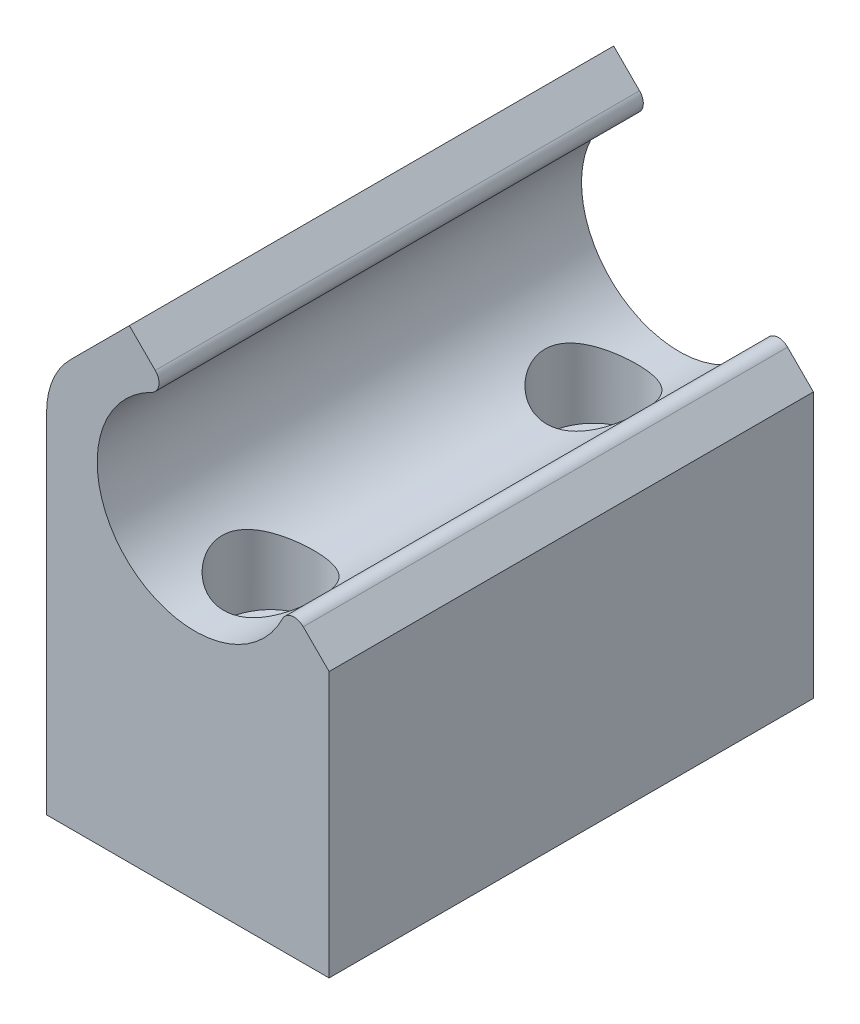
ISO-10303-21;
HEADER;
FILE_DESCRIPTION(('STEP AP214'),'2;1');
FILE_NAME('part.step','',(''),(''),'','','');
FILE_SCHEMA(('AUTOMOTIVE_DESIGN { 1 0 10303 214 1 1 1 1 }'));
ENDSEC;
DATA;
#1=APPLICATION_CONTEXT('core data for automotive mechanical design processes');
#2=APPLICATION_PROTOCOL_DEFINITION('international standard','automotive_design',2000,#1);
#3=PRODUCT_CONTEXT('',#1,'mechanical');
#4=PRODUCT('Part','Part','',(#3));
#5=PRODUCT_RELATED_PRODUCT_CATEGORY('part','',(#4));
#6=PRODUCT_DEFINITION_FORMATION('','',#4);
#7=PRODUCT_DEFINITION_CONTEXT('part definition',#1,'design');
#8=PRODUCT_DEFINITION('design','',#6,#7);
#9=PRODUCT_DEFINITION_SHAPE('','',#8);
#10=(LENGTH_UNIT() NAMED_UNIT(*) SI_UNIT(.MILLI.,.METRE.));
#11=(NAMED_UNIT(*) PLANE_ANGLE_UNIT() SI_UNIT($,.RADIAN.));
#12=(NAMED_UNIT(*) SI_UNIT($,.STERADIAN.) SOLID_ANGLE_UNIT());
#13=UNCERTAINTY_MEASURE_WITH_UNIT(LENGTH_MEASURE(1.E-05),#10,'distance_accuracy_value','');
#14=(GEOMETRIC_REPRESENTATION_CONTEXT(3) GLOBAL_UNCERTAINTY_ASSIGNED_CONTEXT((#13)) GLOBAL_UNIT_ASSIGNED_CONTEXT((#10,
#11,#12)) REPRESENTATION_CONTEXT('',''));
#15=CARTESIAN_POINT('',(0.,0.,0.));
#16=DIRECTION('',(0.,0.,1.));
#17=DIRECTION('',(1.,0.,0.));
#18=AXIS2_PLACEMENT_3D('',#15,#16,#17);
#19=CARTESIAN_POINT('',(9.1857781045255,20.4974390727315,30.));
#20=DIRECTION('',(0.,0.,-1.));
#21=DIRECTION('',(-1.,0.,0.));
#22=AXIS2_PLACEMENT_3D('',#19,#20,#21);
#23=CYLINDRICAL_SURFACE('',#22,6.05);
#24=CARTESIAN_POINT('',(9.1857781045255,20.4974390727315,30.));
#25=DIRECTION('',(0.,0.,-1.));
#26=DIRECTION('',(-1.,0.,0.));
#27=AXIS2_PLACEMENT_3D('',#24,#25,#26);
#28=CIRCLE('',#27,6.05);
#29=CARTESIAN_POINT('',(14.6152124653708,17.8284050674642,30.));
#30=VERTEX_POINT('',#29);
#31=CARTESIAN_POINT('',(6.51674409925826,25.9268734335767,30.));
#32=VERTEX_POINT('',#31);
#33=EDGE_CURVE('E209',#30,#32,#28,.T.);
#34=ORIENTED_EDGE('',*,*,#33,.F.);
#35=DIRECTION('',(0.,0.,-1.));
#36=VECTOR('',#35,1.);
#37=CARTESIAN_POINT('',(14.6152124653708,17.8284050674642,30.));
#38=LINE('',#37,#36);
#39=CARTESIAN_POINT('',(14.6152124653708,17.8284050674642,0.));
#40=VERTEX_POINT('',#39);
#41=EDGE_CURVE('E134',#30,#40,#38,.T.);
#42=ORIENTED_EDGE('',*,*,#41,.T.);
#43=CARTESIAN_POINT('',(9.1857781045255,20.4974390727315,0.));
#44=DIRECTION('',(0.,0.,-1.));
#45=DIRECTION('',(-1.,0.,0.));
#46=AXIS2_PLACEMENT_3D('',#43,#44,#45);
#47=CIRCLE('',#46,6.05);
#48=CARTESIAN_POINT('',(6.51674409925826,25.9268734335767,0.));
#49=VERTEX_POINT('',#48);
#50=EDGE_CURVE('E228',#40,#49,#47,.T.);
#51=ORIENTED_EDGE('',*,*,#50,.T.);
#52=DIRECTION('',(0.,0.,-1.));
#53=VECTOR('',#52,1.);
#54=CARTESIAN_POINT('',(6.51674409925826,25.9268734335767,30.));
#55=LINE('',#54,#53);
#56=EDGE_CURVE('E132',#49,#32,#55,.F.);
#57=ORIENTED_EDGE('',*,*,#56,.T.);
#58=EDGE_LOOP('',(#34,#42,#51,#57));
#59=FACE_BOUND('',#58,.T.);
#60=CARTESIAN_POINT('',(8.87549528494813,14.4554009586614,28.));
#61=CARTESIAN_POINT('',(9.03139950122602,14.4474043562475,27.9999884682132));
#62=CARTESIAN_POINT('',(9.18779808214235,14.4454769481439,27.9877768449764));
#63=CARTESIAN_POINT('',(9.49662535559507,14.4534467326332,27.939170372275));
#64=CARTESIAN_POINT('',(9.64904699591284,14.4633636416657,27.9027352443801));
#65=CARTESIAN_POINT('',(9.94496611693315,14.4934249827461,27.8071919153995));
#66=CARTESIAN_POINT('',(10.088490372713,14.5135368716997,27.7481560034838));
#67=CARTESIAN_POINT('',(10.3636691682537,14.5615640202398,27.6094261179907));
#68=CARTESIAN_POINT('',(10.4953240499643,14.5894790549271,27.5297327397992));
#69=CARTESIAN_POINT('',(10.7502788587051,14.6516807365972,27.3475349797805));
#70=CARTESIAN_POINT('',(10.8728583994436,14.6862116916424,27.2441078185814));
#71=CARTESIAN_POINT('',(11.09984891244,14.7569691427747,27.019354128965));
#72=CARTESIAN_POINT('',(11.2042489267968,14.7931966448961,26.8980168859025));
#73=CARTESIAN_POINT('',(11.3998914951163,14.866105176999,26.6300252938702));
#74=CARTESIAN_POINT('',(11.4895348563626,14.9026120843056,26.4821485884913));
#75=CARTESIAN_POINT('',(11.642570867745,14.9680956075067,26.1718295053516));
#76=CARTESIAN_POINT('',(11.705973996028,14.9970752274434,26.0093929731479));
#77=CARTESIAN_POINT('',(11.8021735069858,15.0421910675907,25.6803361510441));
#78=CARTESIAN_POINT('',(11.8359836555846,15.0587496527199,25.5140734029774));
#79=CARTESIAN_POINT('',(11.8750191615476,15.0779375819468,25.1774857684325));
#80=CARTESIAN_POINT('',(11.8802668062833,15.0805777865305,25.0071641533644));
#81=CARTESIAN_POINT('',(11.8628181806249,15.0719441034705,24.6845307256137));
#82=CARTESIAN_POINT('',(11.8427096597932,15.0619584898042,24.5320348069978));
#83=CARTESIAN_POINT('',(11.7797850452715,15.0316516145652,24.2328784775741));
#84=CARTESIAN_POINT('',(11.7369634520435,15.0113278498549,24.0862194893175));
#85=CARTESIAN_POINT('',(11.6294066801047,14.9625778429141,23.8001301326586));
#86=CARTESIAN_POINT('',(11.5643565085781,14.9340361170623,23.6608389008156));
#87=CARTESIAN_POINT('',(11.4143686578002,14.8722766963616,23.3945404094432));
#88=CARTESIAN_POINT('',(11.3294224796463,14.8390570056689,23.2675384323227));
#89=CARTESIAN_POINT('',(11.1321835410953,14.7680388466723,23.0162369263696));
#90=CARTESIAN_POINT('',(11.0180211402644,14.7301117062275,22.8934362407789));
#91=CARTESIAN_POINT('',(10.7703027638599,14.6571956977562,22.6681023647629));
#92=CARTESIAN_POINT('',(10.6367412657133,14.6222076709342,22.5655749654693));
#93=CARTESIAN_POINT('',(10.3495689921729,14.5585656625862,22.3814335797287));
#94=CARTESIAN_POINT('',(10.1955448033763,14.5300892865607,22.3003980892383));
#95=CARTESIAN_POINT('',(9.87436477748037,14.4845720011071,22.1658315230099));
#96=CARTESIAN_POINT('',(9.70721906756909,14.4675223675939,22.1122794715607));
#97=CARTESIAN_POINT('',(9.37916590008335,14.4484813273953,22.0381974626905));
#98=CARTESIAN_POINT('',(9.21884562249271,14.4453845289122,22.0153489461199));
#99=CARTESIAN_POINT('',(8.89691648037471,14.4521976626231,21.9957495066285));
#100=CARTESIAN_POINT('',(8.73530804581879,14.4621034217002,21.9989902121935));
#101=CARTESIAN_POINT('',(8.42541232444363,14.4935073034282,22.03010813462));
#102=CARTESIAN_POINT('',(8.27690059816905,14.5142893388708,22.056525112841));
#103=CARTESIAN_POINT('',(7.98707655238687,14.5655516468352,22.1306622206776));
#104=CARTESIAN_POINT('',(7.84576543698287,14.5960335352558,22.1783859003115));
#105=CARTESIAN_POINT('',(7.56697382975105,14.6661788404638,22.2959802836046));
#106=CARTESIAN_POINT('',(7.4299778408795,14.7062035986546,22.3667784978471));
#107=CARTESIAN_POINT('',(7.16956518845382,14.7916350755925,22.5275013347356));
#108=CARTESIAN_POINT('',(7.04615506229741,14.8370443636877,22.6174351047282));
#109=CARTESIAN_POINT('',(6.80229039905101,14.9350156024313,22.82510855536));
#110=CARTESIAN_POINT('',(6.68359123576775,14.9878206809356,22.9448013555173));
#111=CARTESIAN_POINT('',(6.46736656834592,15.0912271099332,23.2029657019698));
#112=CARTESIAN_POINT('',(6.3698587683695,15.141826589781,23.3414527941189));
#113=CARTESIAN_POINT('',(6.19494795202944,15.2374177669954,23.6413398023546));
#114=CARTESIAN_POINT('',(6.11857926206208,15.2820784294398,23.8034648394267));
#115=CARTESIAN_POINT('',(6.02617872039569,15.3379120469423,24.0568649344285));
#116=CARTESIAN_POINT('',(5.99907408067541,15.35466128009,24.1430140441605));
#117=CARTESIAN_POINT('',(5.95261318254559,15.3837417047745,24.3181288589389));
#118=CARTESIAN_POINT('',(5.93325523714561,15.3960738581531,24.4070939461937));
#119=CARTESIAN_POINT('',(5.90457256610746,15.4144830682945,24.5757365720437));
#120=CARTESIAN_POINT('',(5.89429824134949,15.4211480484709,24.6551901540139));
#121=CARTESIAN_POINT('',(5.88013863406065,15.4303570629557,24.814898591548));
#122=CARTESIAN_POINT('',(5.87625250893076,15.4329016407417,24.8951533400336));
#123=CARTESIAN_POINT('',(5.87493923433004,15.4337597643954,25.0557137543537));
#124=CARTESIAN_POINT('',(5.87750981964802,15.4320747941179,25.1360193924523));
#125=CARTESIAN_POINT('',(5.88905071700072,15.424557340694,25.2959495605022));
#126=CARTESIAN_POINT('',(5.89802074755596,15.4187250399678,25.3755741202548));
#127=CARTESIAN_POINT('',(5.9315876511128,15.3971021815212,25.5944743643302));
#128=CARTESIAN_POINT('',(5.96290174999751,15.3771001838947,25.7323706845501));
#129=CARTESIAN_POINT('',(6.0438194705235,15.3270600301928,26.000652593341));
#130=CARTESIAN_POINT('',(6.0934292178601,15.2970185130313,26.1310356494178));
#131=CARTESIAN_POINT('',(6.2140911613304,15.2270670027082,26.3926050806416));
#132=CARTESIAN_POINT('',(6.28657939839812,15.1865455922407,26.5229629488515));
#133=CARTESIAN_POINT('',(6.44915917513535,15.1009724877273,26.7705530207602));
#134=CARTESIAN_POINT('',(6.53926060567717,15.0559182551593,26.8877777909743));
#135=CARTESIAN_POINT('',(6.75022416905689,14.9579392804971,27.1241368962574));
#136=CARTESIAN_POINT('',(6.87367521154988,14.9048508984646,27.2409012101503));
#137=CARTESIAN_POINT('',(7.1396155368062,14.80217882074,27.452668857923));
#138=CARTESIAN_POINT('',(7.2821189939908,14.7525977768056,27.5476558458985));
#139=CARTESIAN_POINT('',(7.5099657180754,14.6835987287743,27.6726669562825));
#140=CARTESIAN_POINT('',(7.58950715245339,14.6612152691553,27.7118533633208));
#141=CARTESIAN_POINT('',(7.75232825978302,14.6191081724481,27.7832327540107));
#142=CARTESIAN_POINT('',(7.83560609394893,14.5993832457507,27.8154291330698));
#143=CARTESIAN_POINT('',(8.00512817653033,14.563126567902,27.8723578620836));
#144=CARTESIAN_POINT('',(8.09136521832527,14.5465876293115,27.8971070851428));
#145=CARTESIAN_POINT('',(8.26624523273616,14.5170700214946,27.9388582892593));
#146=CARTESIAN_POINT('',(8.35488665526586,14.5040891156906,27.9558651416315));
#147=CARTESIAN_POINT('',(8.51546118610677,14.4842610224246,27.9791843209241));
#148=CARTESIAN_POINT('',(8.58709447263674,14.4767019506256,27.9869742880269));
#149=CARTESIAN_POINT('',(8.73094810635742,14.4641267078896,27.9973849958789));
#150=CARTESIAN_POINT('',(8.80316849707305,14.4591107272637,28.0000053498046));
#151=CARTESIAN_POINT('',(8.87549528494813,14.4554009586614,28.));
#152=B_SPLINE_CURVE_WITH_KNOTS('',3,(#60,#61,#62,#63,#64,#65,#66,#67,#68,#69,#70,#71,#72,#73,
#74,#75,#76,#77,#78,#79,#80,#81,#82,#83,#84,#85,#86,#87,#88,#89,#90,#91,#92,#93,#94,#95,#96,#97,
#98,#99,#100,#101,#102,#103,#104,#105,#106,#107,#108,#109,#110,#111,#112,#113,#114,#115,#116,
#117,#118,#119,#120,#121,#122,#123,#124,#125,#126,#127,#128,#129,#130,#131,#132,#133,#134,#135,
#136,#137,#138,#139,#140,#141,#142,#143,#144,#145,#146,#147,#148,#149,#150,#151),.UNSPECIFIED.,
.T.,.F.,(4,2,2,2,2,2,2,2,2,2,2,2,2,2,2,2,2,2,2,2,2,2,2,2,2,2,2,2,2,2,2,2,2,2,2,2,2,2,2,2,2,2,2,
2,2,4),(0.,0.468051519431484,0.936883259942433,1.40422779275271,1.87155885733728,
2.36167663777968,2.85208882689793,3.37970829950646,3.90711688141939,4.41565830874937,
4.92380286337145,5.38404252648297,5.84439367877282,6.31155917403818,6.77892459176479,
7.29233304118356,7.80588793624416,8.33211545302118,8.85794074673161,9.34127944264786,
9.82446305093993,10.2792275979235,10.7340679438385,11.2100805728486,11.6863212628887,
12.2139430832411,12.7420040210141,13.2925772538213,13.5677452144805,13.8428532194166,
14.0836830237557,14.3244810602639,14.5651946292688,14.805897611145,15.2323284284895,
15.6589021519645,16.1208194904601,16.5829969725004,17.1147631823857,17.6469272348777,
17.9209644880393,18.1948683282359,18.4681468258848,18.7412531447837,18.9583744708216,
19.1755120426509),.UNSPECIFIED.);
#153=CARTESIAN_POINT('',(8.87549528494813,14.4554009586614,28.));
#154=VERTEX_POINT('',#153);
#155=EDGE_CURVE('E156',#154,#154,#152,.T.);
#156=ORIENTED_EDGE('',*,*,#155,.F.);
#157=EDGE_LOOP('',(#156));
#158=FACE_BOUND('',#157,.T.);
#159=CARTESIAN_POINT('',(8.87549528494813,14.4554009586614,8.));
#160=CARTESIAN_POINT('',(9.03139950122602,14.4474043562475,7.99998846821321));
#161=CARTESIAN_POINT('',(9.18779808214235,14.4454769481439,7.98777684497635));
#162=CARTESIAN_POINT('',(9.49662535559507,14.4534467326332,7.93917037227496));
#163=CARTESIAN_POINT('',(9.64904699591284,14.4633636416657,7.9027352443801));
#164=CARTESIAN_POINT('',(9.94496611693315,14.4934249827461,7.80719191539948));
#165=CARTESIAN_POINT('',(10.0884903727129,14.5135368716997,7.74815600348381));
#166=CARTESIAN_POINT('',(10.3636691682537,14.5615640202398,7.6094261179907));
#167=CARTESIAN_POINT('',(10.4953240499643,14.5894790549271,7.52973273979915));
#168=CARTESIAN_POINT('',(10.7502788587051,14.6516807365972,7.34753497978051));
#169=CARTESIAN_POINT('',(10.8728583994436,14.6862116916424,7.24410781858141));
#170=CARTESIAN_POINT('',(11.09984891244,14.7569691427747,7.01935412896496));
#171=CARTESIAN_POINT('',(11.2042489267968,14.7931966448961,6.89801688590247));
#172=CARTESIAN_POINT('',(11.3998914951163,14.866105176999,6.63002529387015));
#173=CARTESIAN_POINT('',(11.4895348563626,14.9026120843056,6.48214858849132));
#174=CARTESIAN_POINT('',(11.642570867745,14.9680956075067,6.17182950535158));
#175=CARTESIAN_POINT('',(11.705973996028,14.9970752274434,6.00939297314791));
#176=CARTESIAN_POINT('',(11.8021735069858,15.0421910675907,5.68033615104408));
#177=CARTESIAN_POINT('',(11.8359836555846,15.0587496527199,5.51407340297739));
#178=CARTESIAN_POINT('',(11.8750191615476,15.0779375819468,5.17748576843248));
#179=CARTESIAN_POINT('',(11.8802668062833,15.0805777865305,5.0071641533644));
#180=CARTESIAN_POINT('',(11.8628181806249,15.0719441034705,4.68453072561368));
#181=CARTESIAN_POINT('',(11.8427096597932,15.0619584898042,4.53203480699778));
#182=CARTESIAN_POINT('',(11.7797850452715,15.0316516145652,4.23287847757408));
#183=CARTESIAN_POINT('',(11.7369634520435,15.0113278498549,4.08621948931746));
#184=CARTESIAN_POINT('',(11.6294066801047,14.9625778429141,3.80013013265858));
#185=CARTESIAN_POINT('',(11.5643565085781,14.9340361170623,3.66083890081561));
#186=CARTESIAN_POINT('',(11.4143686578002,14.8722766963616,3.39454040944315));
#187=CARTESIAN_POINT('',(11.3294224796463,14.8390570056689,3.2675384323227));
#188=CARTESIAN_POINT('',(11.1321835410953,14.7680388466723,3.01623692636957));
#189=CARTESIAN_POINT('',(11.0180211402644,14.7301117062275,2.89343624077893));
#190=CARTESIAN_POINT('',(10.7703027638599,14.6571956977562,2.66810236476289));
#191=CARTESIAN_POINT('',(10.6367412657133,14.6222076709342,2.56557496546932));
#192=CARTESIAN_POINT('',(10.3495689921729,14.5585656625862,2.38143357972874));
#193=CARTESIAN_POINT('',(10.1955448033763,14.5300892865607,2.30039808923825));
#194=CARTESIAN_POINT('',(9.87436477748037,14.4845720011071,2.16583152300988));
#195=CARTESIAN_POINT('',(9.70721906756909,14.4675223675939,2.11227947156065));
#196=CARTESIAN_POINT('',(9.37916590008335,14.4484813273953,2.03819746269052));
#197=CARTESIAN_POINT('',(9.21884562249271,14.4453845289122,2.01534894611987));
#198=CARTESIAN_POINT('',(8.89691648037471,14.4521976626231,1.99574950662849));
#199=CARTESIAN_POINT('',(8.73530804581879,14.4621034217002,1.99899021219348));
#200=CARTESIAN_POINT('',(8.42541232444363,14.4935073034282,2.03010813462003));
#201=CARTESIAN_POINT('',(8.27690059816906,14.5142893388708,2.05652511284096));
#202=CARTESIAN_POINT('',(7.98707655238687,14.5655516468352,2.13066222067764));
#203=CARTESIAN_POINT('',(7.84576543698287,14.5960335352558,2.17838590031148));
#204=CARTESIAN_POINT('',(7.56697382975105,14.6661788404638,2.29598028360457));
#205=CARTESIAN_POINT('',(7.4299778408795,14.7062035986546,2.36677849784712));
#206=CARTESIAN_POINT('',(7.16956518845382,14.7916350755925,2.52750133473555));
#207=CARTESIAN_POINT('',(7.04615506229742,14.8370443636877,2.6174351047282));
#208=CARTESIAN_POINT('',(6.80229039905101,14.9350156024313,2.82510855536));
#209=CARTESIAN_POINT('',(6.68359123576775,14.9878206809356,2.94480135551732));
#210=CARTESIAN_POINT('',(6.46736656834592,15.0912271099332,3.20296570196979));
#211=CARTESIAN_POINT('',(6.3698587683695,15.141826589781,3.3414527941189));
#212=CARTESIAN_POINT('',(6.19494795202944,15.2374177669954,3.64133980235455));
#213=CARTESIAN_POINT('',(6.11857926206208,15.2820784294398,3.8034648394267));
#214=CARTESIAN_POINT('',(6.02617872039569,15.3379120469423,4.05686493442845));
#215=CARTESIAN_POINT('',(5.99907408067541,15.35466128009,4.14301404416052));
#216=CARTESIAN_POINT('',(5.95261318254559,15.3837417047745,4.31812885893888));
#217=CARTESIAN_POINT('',(5.93325523714561,15.3960738581531,4.40709394619366));
#218=CARTESIAN_POINT('',(5.90457256610746,15.4144830682945,4.57573657204369));
#219=CARTESIAN_POINT('',(5.89429824134949,15.4211480484709,4.65519015401389));
#220=CARTESIAN_POINT('',(5.88013863406065,15.4303570629557,4.81489859154803));
#221=CARTESIAN_POINT('',(5.87625250893076,15.4329016407417,4.89515334003358));
#222=CARTESIAN_POINT('',(5.87493923433004,15.4337597643954,5.05571375435374));
#223=CARTESIAN_POINT('',(5.87750981964802,15.4320747941179,5.13601939245235));
#224=CARTESIAN_POINT('',(5.88905071700072,15.424557340694,5.29594956050222));
#225=CARTESIAN_POINT('',(5.89802074755596,15.4187250399678,5.37557412025482));
#226=CARTESIAN_POINT('',(5.9315876511128,15.3971021815212,5.59447436433022));
#227=CARTESIAN_POINT('',(5.96290174999751,15.3771001838947,5.73237068455012));
#228=CARTESIAN_POINT('',(6.0438194705235,15.3270600301928,6.00065259334102));
#229=CARTESIAN_POINT('',(6.09342921786011,15.2970185130313,6.1310356494178));
#230=CARTESIAN_POINT('',(6.2140911613304,15.2270670027082,6.39260508064161));
#231=CARTESIAN_POINT('',(6.28657939839812,15.1865455922407,6.52296294885154));
#232=CARTESIAN_POINT('',(6.44915917513535,15.1009724877273,6.77055302076015));
#233=CARTESIAN_POINT('',(6.53926060567717,15.0559182551593,6.88777779097431));
#234=CARTESIAN_POINT('',(6.75022416905689,14.9579392804971,7.12413689625742));
#235=CARTESIAN_POINT('',(6.87367521154988,14.9048508984646,7.24090121015031));
#236=CARTESIAN_POINT('',(7.1396155368062,14.80217882074,7.45266885792299));
#237=CARTESIAN_POINT('',(7.2821189939908,14.7525977768056,7.54765584589848));
#238=CARTESIAN_POINT('',(7.5099657180754,14.6835987287743,7.6726669562825));
#239=CARTESIAN_POINT('',(7.58950715245339,14.6612152691553,7.7118533633208));
#240=CARTESIAN_POINT('',(7.75232825978302,14.6191081724481,7.78323275401069));
#241=CARTESIAN_POINT('',(7.83560609394892,14.5993832457507,7.8154291330698));
#242=CARTESIAN_POINT('',(8.00512817653033,14.563126567902,7.87235786208361));
#243=CARTESIAN_POINT('',(8.09136521832527,14.5465876293115,7.89710708514279));
#244=CARTESIAN_POINT('',(8.26624523273616,14.5170700214946,7.93885828925927));
#245=CARTESIAN_POINT('',(8.35488665526586,14.5040891156906,7.95586514163149));
#246=CARTESIAN_POINT('',(8.51546118610677,14.4842610224246,7.97918432092407));
#247=CARTESIAN_POINT('',(8.58709447263674,14.4767019506256,7.98697428802689));
#248=CARTESIAN_POINT('',(8.73094810635742,14.4641267078896,7.99738499587894));
#249=CARTESIAN_POINT('',(8.80316849707305,14.4591107272637,8.00000534980462));
#250=CARTESIAN_POINT('',(8.87549528494813,14.4554009586614,8.));
#251=B_SPLINE_CURVE_WITH_KNOTS('',3,(#159,#160,#161,#162,#163,#164,#165,#166,#167,#168,#169,
#170,#171,#172,#173,#174,#175,#176,#177,#178,#179,#180,#181,#182,#183,#184,#185,#186,#187,#188,
#189,#190,#191,#192,#193,#194,#195,#196,#197,#198,#199,#200,#201,#202,#203,#204,#205,#206,#207,
#208,#209,#210,#211,#212,#213,#214,#215,#216,#217,#218,#219,#220,#221,#222,#223,#224,#225,#226,
#227,#228,#229,#230,#231,#232,#233,#234,#235,#236,#237,#238,#239,#240,#241,#242,#243,#244,#245,
#246,#247,#248,#249,#250),.UNSPECIFIED.,.T.,.F.,(4,2,2,2,2,2,2,2,2,2,2,2,2,2,2,2,2,2,2,2,2,2,2,
2,2,2,2,2,2,2,2,2,2,2,2,2,2,2,2,2,2,2,2,2,2,4),(0.,0.468051519431484,0.936883259942432,
1.40422779275271,1.87155885733728,2.36167663777967,2.85208882689792,3.37970829950646,
3.90711688141939,4.41565830874937,4.92380286337144,5.38404252648297,5.84439367877282,
6.31155917403817,6.77892459176479,7.29233304118356,7.80588793624416,8.33211545302118,
8.85794074673161,9.34127944264786,9.82446305093993,10.2792275979235,10.7340679438385,
11.2100805728486,11.6863212628887,12.2139430832411,12.7420040210141,13.2925772538213,
13.5677452144805,13.8428532194166,14.0836830237557,14.3244810602639,14.5651946292688,
14.805897611145,15.2323284284895,15.6589021519645,16.1208194904601,16.5829969725004,
17.1147631823857,17.6469272348777,17.9209644880393,18.1948683282359,18.4681468258848,
18.7412531447837,18.9583744708216,19.1755120426509),.UNSPECIFIED.);
#252=CARTESIAN_POINT('',(8.87549528494813,14.4554009586614,8.));
#253=VERTEX_POINT('',#252);
#254=EDGE_CURVE('E164',#253,#253,#251,.T.);
#255=ORIENTED_EDGE('',*,*,#254,.F.);
#256=EDGE_LOOP('',(#255));
#257=FACE_BOUND('',#256,.T.);
#258=ADVANCED_FACE('F32',(#59,#158,#257),#23,.F.);
#259=CARTESIAN_POINT('',(0.,23.6833219364119,30.));
#260=DIRECTION('',(1.,0.,0.));
#261=DIRECTION('',(0.,1.,0.));
#262=AXIS2_PLACEMENT_3D('',#259,#260,#261);
#263=PLANE('',#262);
#264=DIRECTION('',(0.,-1.,0.));
#265=VECTOR('',#264,1.);
#266=CARTESIAN_POINT('',(0.,23.6833219364119,30.));
#267=LINE('',#266,#265);
#268=CARTESIAN_POINT('',(0.,21.6122541245464,30.));
#269=VERTEX_POINT('',#268);
#270=CARTESIAN_POINT('',(0.,0.,30.));
#271=VERTEX_POINT('',#270);
#272=EDGE_CURVE('E108',#269,#271,#267,.T.);
#273=ORIENTED_EDGE('',*,*,#272,.F.);
#274=DIRECTION('',(0.,0.,-1.));
#275=VECTOR('',#274,1.);
#276=CARTESIAN_POINT('',(0.,21.6122541245464,30.));
#277=LINE('',#276,#275);
#278=CARTESIAN_POINT('',(0.,21.6122541245464,0.));
#279=VERTEX_POINT('',#278);
#280=EDGE_CURVE('E155',#269,#279,#277,.T.);
#281=ORIENTED_EDGE('',*,*,#280,.T.);
#282=DIRECTION('',(0.,-1.,0.));
#283=VECTOR('',#282,1.);
#284=CARTESIAN_POINT('',(0.,23.6833219364119,0.));
#285=LINE('',#284,#283);
#286=CARTESIAN_POINT('',(0.,0.,0.));
#287=VERTEX_POINT('',#286);
#288=EDGE_CURVE('E130',#279,#287,#285,.T.);
#289=ORIENTED_EDGE('',*,*,#288,.T.);
#290=DIRECTION('',(0.,0.,-1.));
#291=VECTOR('',#290,1.);
#292=CARTESIAN_POINT('',(0.,0.,30.));
#293=LINE('',#292,#291);
#294=EDGE_CURVE('E123',#271,#287,#293,.T.);
#295=ORIENTED_EDGE('',*,*,#294,.F.);
#296=EDGE_LOOP('',(#273,#281,#289,#295));
#297=FACE_BOUND('',#296,.T.);
#298=ADVANCED_FACE('F129',(#297),#263,.F.);
#299=CARTESIAN_POINT('',(0.,0.,30.));
#300=DIRECTION('',(0.,1.,0.));
#301=DIRECTION('',(0.,0.,1.));
#302=AXIS2_PLACEMENT_3D('',#299,#300,#301);
#303=PLANE('',#302);
#304=CARTESIAN_POINT('',(8.87549528494813,0.,5.));
#305=DIRECTION('',(0.,-1.,0.));
#306=DIRECTION('',(0.,0.,-1.));
#307=AXIS2_PLACEMENT_3D('',#304,#305,#306);
#308=CIRCLE('',#307,1.55);
#309=CARTESIAN_POINT('',(8.87549528494813,0.,3.45));
#310=VERTEX_POINT('',#309);
#311=EDGE_CURVE('E268',#310,#310,#308,.T.);
#312=ORIENTED_EDGE('',*,*,#311,.F.);
#313=EDGE_LOOP('',(#312));
#314=FACE_BOUND('',#313,.T.);
#315=CARTESIAN_POINT('',(8.87549528494813,0.,25.));
#316=DIRECTION('',(0.,-1.,0.));
#317=DIRECTION('',(0.,0.,-1.));
#318=AXIS2_PLACEMENT_3D('',#315,#316,#317);
#319=CIRCLE('',#318,1.55);
#320=CARTESIAN_POINT('',(8.87549528494813,0.,23.45));
#321=VERTEX_POINT('',#320);
#322=EDGE_CURVE('E265',#321,#321,#319,.T.);
#323=ORIENTED_EDGE('',*,*,#322,.F.);
#324=EDGE_LOOP('',(#323));
#325=FACE_BOUND('',#324,.T.);
#326=DIRECTION('',(1.,0.,0.));
#327=VECTOR('',#326,1.);
#328=CARTESIAN_POINT('',(0.,0.,0.));
#329=LINE('',#328,#327);
#330=CARTESIAN_POINT('',(17.5,0.,0.));
#331=VERTEX_POINT('',#330);
#332=EDGE_CURVE('E216',#287,#331,#329,.T.);
#333=ORIENTED_EDGE('',*,*,#332,.T.);
#334=DIRECTION('',(0.,0.,-1.));
#335=VECTOR('',#334,1.);
#336=CARTESIAN_POINT('',(17.5,0.,30.));
#337=LINE('',#336,#335);
#338=CARTESIAN_POINT('',(17.5,0.,30.));
#339=VERTEX_POINT('',#338);
#340=EDGE_CURVE('E125',#339,#331,#337,.T.);
#341=ORIENTED_EDGE('',*,*,#340,.F.);
#342=DIRECTION('',(1.,0.,0.));
#343=VECTOR('',#342,1.);
#344=CARTESIAN_POINT('',(0.,0.,30.));
#345=LINE('',#344,#343);
#346=EDGE_CURVE('E111',#271,#339,#345,.T.);
#347=ORIENTED_EDGE('',*,*,#346,.F.);
#348=ORIENTED_EDGE('',*,*,#294,.T.);
#349=EDGE_LOOP('',(#333,#341,#347,#348));
#350=FACE_BOUND('',#349,.T.);
#351=ADVANCED_FACE('F122',(#314,#325,#350),#303,.F.);
#352=CARTESIAN_POINT('',(17.5,0.,30.));
#353=DIRECTION('',(-1.,0.,0.));
#354=DIRECTION('',(0.,0.,1.));
#355=AXIS2_PLACEMENT_3D('',#352,#353,#354);
#356=PLANE('',#355);
#357=DIRECTION('',(0.,1.,0.));
#358=VECTOR('',#357,1.);
#359=CARTESIAN_POINT('',(17.5,0.,0.));
#360=LINE('',#359,#358);
#361=CARTESIAN_POINT('',(17.5,16.44,0.));
#362=VERTEX_POINT('',#361);
#363=EDGE_CURVE('E218',#331,#362,#360,.T.);
#364=ORIENTED_EDGE('',*,*,#363,.T.);
#365=DIRECTION('',(0.,0.,-1.));
#366=VECTOR('',#365,1.);
#367=CARTESIAN_POINT('',(17.5,16.44,30.));
#368=LINE('',#367,#366);
#369=CARTESIAN_POINT('',(17.5,16.44,30.));
#370=VERTEX_POINT('',#369);
#371=EDGE_CURVE('E136',#370,#362,#368,.T.);
#372=ORIENTED_EDGE('',*,*,#371,.F.);
#373=DIRECTION('',(0.,1.,0.));
#374=VECTOR('',#373,1.);
#375=CARTESIAN_POINT('',(17.5,0.,30.));
#376=LINE('',#375,#374);
#377=EDGE_CURVE('E127',#339,#370,#376,.T.);
#378=ORIENTED_EDGE('',*,*,#377,.F.);
#379=ORIENTED_EDGE('',*,*,#340,.T.);
#380=EDGE_LOOP('',(#364,#372,#378,#379));
#381=FACE_BOUND('',#380,.T.);
#382=ADVANCED_FACE('F197',(#381),#356,.F.);
#383=CARTESIAN_POINT('',(17.5,16.44,30.));
#384=DIRECTION('',(-0.707106781186546,-0.707106781186549,0.));
#385=DIRECTION('',(0.707106781186549,-0.707106781186546,0.));
#386=AXIS2_PLACEMENT_3D('',#383,#384,#385);
#387=PLANE('',#386);
#388=DIRECTION('',(-0.707106781186549,0.707106781186546,0.));
#389=VECTOR('',#388,1.);
#390=CARTESIAN_POINT('',(17.5,16.44,0.));
#391=LINE('',#390,#389);
#392=CARTESIAN_POINT('',(15.8988396239855,18.0411603760145,0.));
#393=VERTEX_POINT('',#392);
#394=EDGE_CURVE('E225',#362,#393,#391,.T.);
#395=ORIENTED_EDGE('',*,*,#394,.T.);
#396=DIRECTION('',(0.,0.,-1.));
#397=VECTOR('',#396,1.);
#398=CARTESIAN_POINT('',(15.8988396239855,18.0411603760145,30.));
#399=LINE('',#398,#397);
#400=CARTESIAN_POINT('',(15.8988396239855,18.0411603760145,30.));
#401=VERTEX_POINT('',#400);
#402=EDGE_CURVE('E146',#393,#401,#399,.F.);
#403=ORIENTED_EDGE('',*,*,#402,.T.);
#404=DIRECTION('',(-0.707106781186549,0.707106781186546,0.));
#405=VECTOR('',#404,1.);
#406=CARTESIAN_POINT('',(17.5,16.44,30.));
#407=LINE('',#406,#405);
#408=EDGE_CURVE('E242',#370,#401,#407,.T.);
#409=ORIENTED_EDGE('',*,*,#408,.F.);
#410=ORIENTED_EDGE('',*,*,#371,.T.);
#411=EDGE_LOOP('',(#395,#403,#409,#410));
#412=FACE_BOUND('',#411,.T.);
#413=ADVANCED_FACE('F192',(#412),#387,.F.);
#414=CARTESIAN_POINT('',(7.60321276594693,26.336787234053,30.));
#415=DIRECTION('',(-0.707106781186546,-0.707106781186549,0.));
#416=DIRECTION('',(0.707106781186549,-0.707106781186546,0.));
#417=AXIS2_PLACEMENT_3D('',#414,#415,#416);
#418=PLANE('',#417);
#419=DIRECTION('',(-0.707106781186549,0.707106781186546,0.));
#420=VECTOR('',#419,1.);
#421=CARTESIAN_POINT('',(7.60321276594693,26.336787234053,30.));
#422=LINE('',#421,#420);
#423=CARTESIAN_POINT('',(6.72949940780852,27.2105005921914,30.));
#424=VERTEX_POINT('',#423);
#425=CARTESIAN_POINT('',(5.12833903179401,28.8116609682059,30.));
#426=VERTEX_POINT('',#425);
#427=EDGE_CURVE('E252',#424,#426,#422,.T.);
#428=ORIENTED_EDGE('',*,*,#427,.F.);
#429=DIRECTION('',(0.,0.,-1.));
#430=VECTOR('',#429,1.);
#431=CARTESIAN_POINT('',(6.72949940780852,27.2105005921914,30.));
#432=LINE('',#431,#430);
#433=CARTESIAN_POINT('',(6.72949940780852,27.2105005921914,0.));
#434=VERTEX_POINT('',#433);
#435=EDGE_CURVE('E152',#424,#434,#432,.T.);
#436=ORIENTED_EDGE('',*,*,#435,.T.);
#437=DIRECTION('',(-0.707106781186549,0.707106781186546,0.));
#438=VECTOR('',#437,1.);
#439=CARTESIAN_POINT('',(7.60321276594693,26.336787234053,0.));
#440=LINE('',#439,#438);
#441=CARTESIAN_POINT('',(5.12833903179401,28.8116609682059,0.));
#442=VERTEX_POINT('',#441);
#443=EDGE_CURVE('E231',#434,#442,#440,.T.);
#444=ORIENTED_EDGE('',*,*,#443,.T.);
#445=DIRECTION('',(0.,0.,-1.));
#446=VECTOR('',#445,1.);
#447=CARTESIAN_POINT('',(5.12833903179401,28.8116609682059,30.));
#448=LINE('',#447,#446);
#449=EDGE_CURVE('E234',#426,#442,#448,.T.);
#450=ORIENTED_EDGE('',*,*,#449,.F.);
#451=EDGE_LOOP('',(#428,#436,#444,#450));
#452=FACE_BOUND('',#451,.T.);
#453=ADVANCED_FACE('F190',(#452),#418,.F.);
#454=CARTESIAN_POINT('',(5.12833903179401,28.8116609682059,30.));
#455=DIRECTION('',(0.707106781186549,-0.707106781186546,0.));
#456=DIRECTION('',(0.707106781186546,0.707106781186549,0.));
#457=AXIS2_PLACEMENT_3D('',#454,#455,#456);
#458=PLANE('',#457);
#459=DIRECTION('',(-0.707106781186546,-0.707106781186548,0.));
#460=VECTOR('',#459,1.);
#461=CARTESIAN_POINT('',(5.12833903179401,28.8116609682059,0.));
#462=LINE('',#461,#460);
#463=CARTESIAN_POINT('',(1.46446609406726,25.1477880304792,0.));
#464=VERTEX_POINT('',#463);
#465=EDGE_CURVE('E118',#442,#464,#462,.T.);
#466=ORIENTED_EDGE('',*,*,#465,.T.);
#467=DIRECTION('',(0.,0.,-1.));
#468=VECTOR('',#467,1.);
#469=CARTESIAN_POINT('',(1.46446609406726,25.1477880304792,30.));
#470=LINE('',#469,#468);
#471=CARTESIAN_POINT('',(1.46446609406726,25.1477880304792,30.));
#472=VERTEX_POINT('',#471);
#473=EDGE_CURVE('E40',#464,#472,#470,.F.);
#474=ORIENTED_EDGE('',*,*,#473,.T.);
#475=DIRECTION('',(-0.707106781186546,-0.707106781186548,0.));
#476=VECTOR('',#475,1.);
#477=CARTESIAN_POINT('',(5.12833903179401,28.8116609682059,30.));
#478=LINE('',#477,#476);
#479=EDGE_CURVE('E221',#426,#472,#478,.T.);
#480=ORIENTED_EDGE('',*,*,#479,.F.);
#481=ORIENTED_EDGE('',*,*,#449,.T.);
#482=EDGE_LOOP('',(#466,#474,#480,#481));
#483=FACE_BOUND('',#482,.T.);
#484=ADVANCED_FACE('F185',(#483),#458,.F.);
#485=CARTESIAN_POINT('',(9.1857781045255,20.4974390727315,30.));
#486=DIRECTION('',(0.,0.,-1.));
#487=DIRECTION('',(-1.,0.,0.));
#488=AXIS2_PLACEMENT_3D('',#485,#486,#487);
#489=PLANE('',#488);
#490=ORIENTED_EDGE('',*,*,#479,.T.);
#491=CARTESIAN_POINT('',(5.,21.6122541245464,30.));
#492=DIRECTION('',(0.,0.,-1.));
#493=DIRECTION('',(-1.,0.,0.));
#494=AXIS2_PLACEMENT_3D('',#491,#492,#493);
#495=CIRCLE('',#494,5.);
#496=EDGE_CURVE('E11',#472,#269,#495,.F.);
#497=ORIENTED_EDGE('',*,*,#496,.T.);
#498=ORIENTED_EDGE('',*,*,#272,.T.);
#499=ORIENTED_EDGE('',*,*,#346,.T.);
#500=ORIENTED_EDGE('',*,*,#377,.T.);
#501=ORIENTED_EDGE('',*,*,#408,.T.);
#502=CARTESIAN_POINT('',(15.3331541990363,17.4754749510653,30.));
#503=DIRECTION('',(0.,0.,-1.));
#504=DIRECTION('',(-1.,0.,0.));
#505=AXIS2_PLACEMENT_3D('',#502,#503,#504);
#506=CIRCLE('',#505,0.8);
#507=EDGE_CURVE('E150',#401,#30,#506,.F.);
#508=ORIENTED_EDGE('',*,*,#507,.T.);
#509=ORIENTED_EDGE('',*,*,#33,.T.);
#510=CARTESIAN_POINT('',(6.16381398285929,26.6448151672422,30.));
#511=DIRECTION('',(0.,0.,-1.));
#512=DIRECTION('',(-1.,0.,0.));
#513=AXIS2_PLACEMENT_3D('',#510,#511,#512);
#514=CIRCLE('',#513,0.8);
#515=EDGE_CURVE('E148',#32,#424,#514,.F.);
#516=ORIENTED_EDGE('',*,*,#515,.T.);
#517=ORIENTED_EDGE('',*,*,#427,.T.);
#518=EDGE_LOOP('',(#490,#497,#498,#499,#500,#501,#508,#509,#516,#517));
#519=FACE_BOUND('',#518,.T.);
#520=ADVANCED_FACE('F110',(#519),#489,.F.);
#521=CARTESIAN_POINT('',(9.1857781045255,20.4974390727315,0.));
#522=DIRECTION('',(0.,0.,-1.));
#523=DIRECTION('',(-1.,0.,0.));
#524=AXIS2_PLACEMENT_3D('',#521,#522,#523);
#525=PLANE('',#524);
#526=ORIENTED_EDGE('',*,*,#288,.F.);
#527=CARTESIAN_POINT('',(5.,21.6122541245464,0.));
#528=DIRECTION('',(0.,0.,-1.));
#529=DIRECTION('',(-1.,0.,0.));
#530=AXIS2_PLACEMENT_3D('',#527,#528,#529);
#531=CIRCLE('',#530,5.);
#532=EDGE_CURVE('E54',#279,#464,#531,.T.);
#533=ORIENTED_EDGE('',*,*,#532,.T.);
#534=ORIENTED_EDGE('',*,*,#465,.F.);
#535=ORIENTED_EDGE('',*,*,#443,.F.);
#536=CARTESIAN_POINT('',(6.16381398285929,26.6448151672422,0.));
#537=DIRECTION('',(0.,0.,-1.));
#538=DIRECTION('',(-1.,0.,0.));
#539=AXIS2_PLACEMENT_3D('',#536,#537,#538);
#540=CIRCLE('',#539,0.8);
#541=EDGE_CURVE('E142',#434,#49,#540,.T.);
#542=ORIENTED_EDGE('',*,*,#541,.T.);
#543=ORIENTED_EDGE('',*,*,#50,.F.);
#544=CARTESIAN_POINT('',(15.3331541990363,17.4754749510653,0.));
#545=DIRECTION('',(0.,0.,-1.));
#546=DIRECTION('',(-1.,0.,0.));
#547=AXIS2_PLACEMENT_3D('',#544,#545,#546);
#548=CIRCLE('',#547,0.8);
#549=EDGE_CURVE('E144',#40,#393,#548,.T.);
#550=ORIENTED_EDGE('',*,*,#549,.T.);
#551=ORIENTED_EDGE('',*,*,#394,.F.);
#552=ORIENTED_EDGE('',*,*,#363,.F.);
#553=ORIENTED_EDGE('',*,*,#332,.F.);
#554=EDGE_LOOP('',(#526,#533,#534,#535,#542,#543,#550,#551,#552,#553));
#555=FACE_BOUND('',#554,.T.);
#556=ADVANCED_FACE('F184',(#555),#525,.T.);
#557=CARTESIAN_POINT('',(15.3331541990363,17.4754749510653,30.));
#558=DIRECTION('',(0.,0.,-1.));
#559=DIRECTION('',(-1.,0.,0.));
#560=AXIS2_PLACEMENT_3D('',#557,#558,#559);
#561=CYLINDRICAL_SURFACE('',#560,0.8);
#562=ORIENTED_EDGE('',*,*,#507,.F.);
#563=ORIENTED_EDGE('',*,*,#402,.F.);
#564=ORIENTED_EDGE('',*,*,#549,.F.);
#565=ORIENTED_EDGE('',*,*,#41,.F.);
#566=EDGE_LOOP('',(#562,#563,#564,#565));
#567=FACE_BOUND('',#566,.T.);
#568=ADVANCED_FACE('F188',(#567),#561,.T.);
#569=CARTESIAN_POINT('',(6.16381398285929,26.6448151672422,30.));
#570=DIRECTION('',(0.,0.,-1.));
#571=DIRECTION('',(-1.,0.,0.));
#572=AXIS2_PLACEMENT_3D('',#569,#570,#571);
#573=CYLINDRICAL_SURFACE('',#572,0.8);
#574=ORIENTED_EDGE('',*,*,#515,.F.);
#575=ORIENTED_EDGE('',*,*,#56,.F.);
#576=ORIENTED_EDGE('',*,*,#541,.F.);
#577=ORIENTED_EDGE('',*,*,#435,.F.);
#578=EDGE_LOOP('',(#574,#575,#576,#577));
#579=FACE_BOUND('',#578,.T.);
#580=ADVANCED_FACE('F180',(#579),#573,.T.);
#581=CARTESIAN_POINT('',(8.87549528494813,10.8284050674642,25.));
#582=DIRECTION('',(0.,1.,0.));
#583=DIRECTION('',(0.,0.,1.));
#584=AXIS2_PLACEMENT_3D('',#581,#582,#583);
#585=CYLINDRICAL_SURFACE('',#584,3.);
#586=CARTESIAN_POINT('',(8.87549528494813,10.8284050674642,25.));
#587=DIRECTION('',(0.,-1.,0.));
#588=DIRECTION('',(0.,0.,-1.));
#589=AXIS2_PLACEMENT_3D('',#586,#587,#588);
#590=CIRCLE('',#589,3.);
#591=CARTESIAN_POINT('',(8.87549528494813,10.8284050674642,22.));
#592=VERTEX_POINT('',#591);
#593=EDGE_CURVE('E259',#592,#592,#590,.T.);
#594=ORIENTED_EDGE('',*,*,#593,.T.);
#595=EDGE_LOOP('',(#594));
#596=FACE_BOUND('',#595,.T.);
#597=ORIENTED_EDGE('',*,*,#155,.T.);
#598=EDGE_LOOP('',(#597));
#599=FACE_BOUND('',#598,.T.);
#600=ADVANCED_FACE('F174',(#596,#599),#585,.F.);
#601=CARTESIAN_POINT('',(8.87549528494813,10.8284050674642,25.));
#602=DIRECTION('',(0.,-1.,0.));
#603=DIRECTION('',(0.,0.,-1.));
#604=AXIS2_PLACEMENT_3D('',#601,#602,#603);
#605=PLANE('',#604);
#606=CARTESIAN_POINT('',(8.87549528494813,10.8284050674642,25.));
#607=DIRECTION('',(0.,-1.,0.));
#608=DIRECTION('',(0.,0.,-1.));
#609=AXIS2_PLACEMENT_3D('',#606,#607,#608);
#610=CIRCLE('',#609,1.55);
#611=CARTESIAN_POINT('',(8.87549528494813,10.8284050674642,23.45));
#612=VERTEX_POINT('',#611);
#613=EDGE_CURVE('E262',#612,#612,#610,.F.);
#614=ORIENTED_EDGE('',*,*,#613,.F.);
#615=EDGE_LOOP('',(#614));
#616=FACE_BOUND('',#615,.T.);
#617=ORIENTED_EDGE('',*,*,#593,.F.);
#618=EDGE_LOOP('',(#617));
#619=FACE_BOUND('',#618,.T.);
#620=ADVANCED_FACE('F179',(#616,#619),#605,.F.);
#621=CARTESIAN_POINT('',(8.87549528494813,10.8284050674642,5.));
#622=DIRECTION('',(0.,1.,0.));
#623=DIRECTION('',(0.,0.,1.));
#624=AXIS2_PLACEMENT_3D('',#621,#622,#623);
#625=CYLINDRICAL_SURFACE('',#624,3.);
#626=CARTESIAN_POINT('',(8.87549528494813,10.8284050674642,5.));
#627=DIRECTION('',(0.,-1.,0.));
#628=DIRECTION('',(0.,0.,-1.));
#629=AXIS2_PLACEMENT_3D('',#626,#627,#628);
#630=CIRCLE('',#629,3.);
#631=CARTESIAN_POINT('',(8.87549528494813,10.8284050674642,2.));
#632=VERTEX_POINT('',#631);
#633=EDGE_CURVE('E165',#632,#632,#630,.T.);
#634=ORIENTED_EDGE('',*,*,#633,.T.);
#635=EDGE_LOOP('',(#634));
#636=FACE_BOUND('',#635,.T.);
#637=ORIENTED_EDGE('',*,*,#254,.T.);
#638=EDGE_LOOP('',(#637));
#639=FACE_BOUND('',#638,.T.);
#640=ADVANCED_FACE('F306',(#636,#639),#625,.F.);
#641=CARTESIAN_POINT('',(8.87549528494813,10.8284050674642,5.));
#642=DIRECTION('',(0.,-1.,0.));
#643=DIRECTION('',(0.,0.,-1.));
#644=AXIS2_PLACEMENT_3D('',#641,#642,#643);
#645=PLANE('',#644);
#646=CARTESIAN_POINT('',(8.87549528494813,10.8284050674642,5.));
#647=DIRECTION('',(0.,-1.,0.));
#648=DIRECTION('',(0.,0.,-1.));
#649=AXIS2_PLACEMENT_3D('',#646,#647,#648);
#650=CIRCLE('',#649,1.55);
#651=CARTESIAN_POINT('',(8.87549528494813,10.8284050674642,3.45));
#652=VERTEX_POINT('',#651);
#653=EDGE_CURVE('E270',#652,#652,#650,.F.);
#654=ORIENTED_EDGE('',*,*,#653,.F.);
#655=EDGE_LOOP('',(#654));
#656=FACE_BOUND('',#655,.T.);
#657=ORIENTED_EDGE('',*,*,#633,.F.);
#658=EDGE_LOOP('',(#657));
#659=FACE_BOUND('',#658,.T.);
#660=ADVANCED_FACE('F314',(#656,#659),#645,.F.);
#661=CARTESIAN_POINT('',(8.87549528494813,0.,5.));
#662=DIRECTION('',(0.,1.,0.));
#663=DIRECTION('',(0.,0.,1.));
#664=AXIS2_PLACEMENT_3D('',#661,#662,#663);
#665=CYLINDRICAL_SURFACE('',#664,1.55);
#666=ORIENTED_EDGE('',*,*,#311,.T.);
#667=EDGE_LOOP('',(#666));
#668=FACE_BOUND('',#667,.T.);
#669=ORIENTED_EDGE('',*,*,#653,.T.);
#670=EDGE_LOOP('',(#669));
#671=FACE_BOUND('',#670,.T.);
#672=ADVANCED_FACE('F320',(#668,#671),#665,.F.);
#673=CARTESIAN_POINT('',(8.87549528494813,0.,25.));
#674=DIRECTION('',(0.,1.,0.));
#675=DIRECTION('',(0.,0.,1.));
#676=AXIS2_PLACEMENT_3D('',#673,#674,#675);
#677=CYLINDRICAL_SURFACE('',#676,1.55);
#678=ORIENTED_EDGE('',*,*,#322,.T.);
#679=EDGE_LOOP('',(#678));
#680=FACE_BOUND('',#679,.T.);
#681=ORIENTED_EDGE('',*,*,#613,.T.);
#682=EDGE_LOOP('',(#681));
#683=FACE_BOUND('',#682,.T.);
#684=ADVANCED_FACE('F328',(#680,#683),#677,.F.);
#685=CARTESIAN_POINT('',(5.,21.6122541245464,30.));
#686=DIRECTION('',(0.,0.,-1.));
#687=DIRECTION('',(-1.,0.,0.));
#688=AXIS2_PLACEMENT_3D('',#685,#686,#687);
#689=CYLINDRICAL_SURFACE('',#688,5.);
#690=ORIENTED_EDGE('',*,*,#496,.F.);
#691=ORIENTED_EDGE('',*,*,#473,.F.);
#692=ORIENTED_EDGE('',*,*,#532,.F.);
#693=ORIENTED_EDGE('',*,*,#280,.F.);
#694=EDGE_LOOP('',(#690,#691,#692,#693));
#695=FACE_BOUND('',#694,.T.);
#696=ADVANCED_FACE('F34',(#695),#689,.T.);
#697=CLOSED_SHELL('',(#258,#298,#351,#382,#413,#453,#484,#520,#556,#568,#580,#600,#620,#640,
#660,#672,#684,#696));
#698=MANIFOLD_SOLID_BREP('B2',#697);
#699=ADVANCED_BREP_SHAPE_REPRESENTATION('',(#18,#698),#14);
#700=SHAPE_DEFINITION_REPRESENTATION(#9,#699);
ENDSEC;
END-ISO-10303-21;
